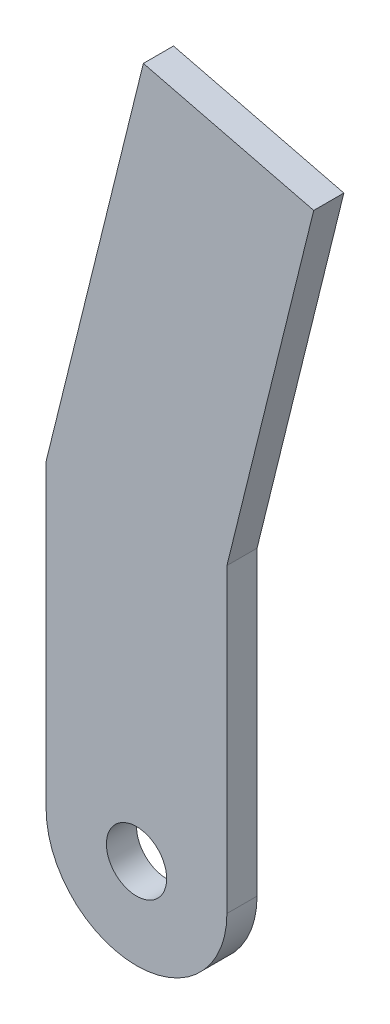
ISO-10303-21;
HEADER;
FILE_DESCRIPTION(('STEP AP214'),'2;1');
FILE_NAME('part.step','',(''),(''),'','','');
FILE_SCHEMA(('AUTOMOTIVE_DESIGN { 1 0 10303 214 1 1 1 1 }'));
ENDSEC;
DATA;
#1=APPLICATION_CONTEXT('core data for automotive mechanical design processes');
#2=APPLICATION_PROTOCOL_DEFINITION('international standard','automotive_design',2000,#1);
#3=PRODUCT_CONTEXT('',#1,'mechanical');
#4=PRODUCT('Part','Part','',(#3));
#5=PRODUCT_RELATED_PRODUCT_CATEGORY('part','',(#4));
#6=PRODUCT_DEFINITION_FORMATION('','',#4);
#7=PRODUCT_DEFINITION_CONTEXT('part definition',#1,'design');
#8=PRODUCT_DEFINITION('design','',#6,#7);
#9=PRODUCT_DEFINITION_SHAPE('','',#8);
#10=(LENGTH_UNIT() NAMED_UNIT(*) SI_UNIT(.MILLI.,.METRE.));
#11=(NAMED_UNIT(*) PLANE_ANGLE_UNIT() SI_UNIT($,.RADIAN.));
#12=(NAMED_UNIT(*) SI_UNIT($,.STERADIAN.) SOLID_ANGLE_UNIT());
#13=UNCERTAINTY_MEASURE_WITH_UNIT(LENGTH_MEASURE(1.E-05),#10,'distance_accuracy_value','');
#14=(GEOMETRIC_REPRESENTATION_CONTEXT(3) GLOBAL_UNCERTAINTY_ASSIGNED_CONTEXT((#13)) GLOBAL_UNIT_ASSIGNED_CONTEXT((#10,
#11,#12)) REPRESENTATION_CONTEXT('',''));
#15=CARTESIAN_POINT('',(0.,0.,0.));
#16=DIRECTION('',(0.,0.,1.));
#17=DIRECTION('',(1.,0.,0.));
#18=AXIS2_PLACEMENT_3D('',#15,#16,#17);
#19=CARTESIAN_POINT('',(0.,0.,5.));
#20=DIRECTION('',(0.,0.,1.));
#21=DIRECTION('',(1.,0.,0.));
#22=AXIS2_PLACEMENT_3D('',#19,#20,#21);
#23=PLANE('',#22);
#24=DIRECTION('',(0.,1.,0.));
#25=VECTOR('',#24,1.);
#26=CARTESIAN_POINT('',(-15.,0.,5.));
#27=LINE('',#26,#25);
#28=CARTESIAN_POINT('',(-15.,0.,5.));
#29=VERTEX_POINT('',#28);
#30=CARTESIAN_POINT('',(-15.,50.,5.));
#31=VERTEX_POINT('',#30);
#32=EDGE_CURVE('E179',#29,#31,#27,.T.);
#33=ORIENTED_EDGE('',*,*,#32,.F.);
#34=CARTESIAN_POINT('',(0.,0.,5.));
#35=DIRECTION('',(0.,0.,1.));
#36=DIRECTION('',(1.,0.,0.));
#37=AXIS2_PLACEMENT_3D('',#34,#35,#36);
#38=CIRCLE('',#37,15.);
#39=CARTESIAN_POINT('',(15.,0.,5.));
#40=VERTEX_POINT('',#39);
#41=EDGE_CURVE('E134',#29,#40,#38,.T.);
#42=ORIENTED_EDGE('',*,*,#41,.T.);
#43=DIRECTION('',(0.,1.,0.));
#44=VECTOR('',#43,1.);
#45=CARTESIAN_POINT('',(15.,0.,5.));
#46=LINE('',#45,#44);
#47=CARTESIAN_POINT('',(15.,50.,5.));
#48=VERTEX_POINT('',#47);
#49=EDGE_CURVE('E126',#40,#48,#46,.T.);
#50=ORIENTED_EDGE('',*,*,#49,.T.);
#51=DIRECTION('',(-0.240080703599402,-0.970752932397948,0.));
#52=VECTOR('',#51,1.);
#53=CARTESIAN_POINT('',(29.4048422159641,108.245175943877,5.));
#54=LINE('',#53,#52);
#55=CARTESIAN_POINT('',(29.4048422159641,108.245175943877,5.));
#56=VERTEX_POINT('',#55);
#57=EDGE_CURVE('E132',#56,#48,#54,.T.);
#58=ORIENTED_EDGE('',*,*,#57,.F.);
#59=DIRECTION('',(0.970752932397949,-0.240080703599402,0.));
#60=VECTOR('',#59,1.);
#61=CARTESIAN_POINT('',(1.13400454318761,115.236947354815,5.));
#62=LINE('',#61,#60);
#63=CARTESIAN_POINT('',(1.13400454318761,115.236947354815,5.));
#64=VERTEX_POINT('',#63);
#65=EDGE_CURVE('E151',#64,#56,#62,.T.);
#66=ORIENTED_EDGE('',*,*,#65,.F.);
#67=DIRECTION('',(0.240080703599402,0.970752932397949,0.));
#68=VECTOR('',#67,1.);
#69=CARTESIAN_POINT('',(-15.,50.,5.));
#70=LINE('',#69,#68);
#71=EDGE_CURVE('E154',#31,#64,#70,.T.);
#72=ORIENTED_EDGE('',*,*,#71,.F.);
#73=EDGE_LOOP('',(#33,#42,#50,#58,#66,#72));
#74=FACE_BOUND('',#73,.T.);
#75=CARTESIAN_POINT('',(0.,0.,5.));
#76=DIRECTION('',(0.,0.,1.));
#77=DIRECTION('',(1.,0.,0.));
#78=AXIS2_PLACEMENT_3D('',#75,#76,#77);
#79=CIRCLE('',#78,5.);
#80=CARTESIAN_POINT('',(5.,0.,5.));
#81=VERTEX_POINT('',#80);
#82=EDGE_CURVE('E165',#81,#81,#79,.T.);
#83=ORIENTED_EDGE('',*,*,#82,.F.);
#84=EDGE_LOOP('',(#83));
#85=FACE_BOUND('',#84,.T.);
#86=ADVANCED_FACE('F66',(#74,#85),#23,.T.);
#87=CARTESIAN_POINT('',(0.,0.,0.));
#88=DIRECTION('',(0.,0.,1.));
#89=DIRECTION('',(1.,0.,0.));
#90=AXIS2_PLACEMENT_3D('',#87,#88,#89);
#91=PLANE('',#90);
#92=DIRECTION('',(0.,1.,0.));
#93=VECTOR('',#92,1.);
#94=CARTESIAN_POINT('',(-15.,0.,0.));
#95=LINE('',#94,#93);
#96=CARTESIAN_POINT('',(-15.,0.,0.));
#97=VERTEX_POINT('',#96);
#98=CARTESIAN_POINT('',(-15.,50.,0.));
#99=VERTEX_POINT('',#98);
#100=EDGE_CURVE('E160',#97,#99,#95,.T.);
#101=ORIENTED_EDGE('',*,*,#100,.T.);
#102=DIRECTION('',(0.240080703599402,0.970752932397949,0.));
#103=VECTOR('',#102,1.);
#104=CARTESIAN_POINT('',(-15.,50.,0.));
#105=LINE('',#104,#103);
#106=CARTESIAN_POINT('',(1.13400454318761,115.236947354815,0.));
#107=VERTEX_POINT('',#106);
#108=EDGE_CURVE('E164',#99,#107,#105,.T.);
#109=ORIENTED_EDGE('',*,*,#108,.T.);
#110=DIRECTION('',(0.970752932397949,-0.240080703599402,0.));
#111=VECTOR('',#110,1.);
#112=CARTESIAN_POINT('',(1.13400454318761,115.236947354815,0.));
#113=LINE('',#112,#111);
#114=CARTESIAN_POINT('',(29.4048422159641,108.245175943877,0.));
#115=VERTEX_POINT('',#114);
#116=EDGE_CURVE('E169',#107,#115,#113,.T.);
#117=ORIENTED_EDGE('',*,*,#116,.T.);
#118=DIRECTION('',(-0.240080703599402,-0.970752932397948,0.));
#119=VECTOR('',#118,1.);
#120=CARTESIAN_POINT('',(29.4048422159641,108.245175943877,0.));
#121=LINE('',#120,#119);
#122=CARTESIAN_POINT('',(15.,50.,0.));
#123=VERTEX_POINT('',#122);
#124=EDGE_CURVE('E173',#115,#123,#121,.T.);
#125=ORIENTED_EDGE('',*,*,#124,.T.);
#126=DIRECTION('',(0.,1.,0.));
#127=VECTOR('',#126,1.);
#128=CARTESIAN_POINT('',(15.,0.,0.));
#129=LINE('',#128,#127);
#130=CARTESIAN_POINT('',(15.,0.,0.));
#131=VERTEX_POINT('',#130);
#132=EDGE_CURVE('E142',#131,#123,#129,.T.);
#133=ORIENTED_EDGE('',*,*,#132,.F.);
#134=CARTESIAN_POINT('',(0.,0.,0.));
#135=DIRECTION('',(0.,0.,1.));
#136=DIRECTION('',(1.,0.,0.));
#137=AXIS2_PLACEMENT_3D('',#134,#135,#136);
#138=CIRCLE('',#137,15.);
#139=EDGE_CURVE('E107',#97,#131,#138,.T.);
#140=ORIENTED_EDGE('',*,*,#139,.F.);
#141=EDGE_LOOP('',(#101,#109,#117,#125,#133,#140));
#142=FACE_BOUND('',#141,.T.);
#143=CARTESIAN_POINT('',(0.,0.,0.));
#144=DIRECTION('',(0.,0.,1.));
#145=DIRECTION('',(1.,0.,0.));
#146=AXIS2_PLACEMENT_3D('',#143,#144,#145);
#147=CIRCLE('',#146,5.);
#148=CARTESIAN_POINT('',(5.,0.,0.));
#149=VERTEX_POINT('',#148);
#150=EDGE_CURVE('E198',#149,#149,#147,.T.);
#151=ORIENTED_EDGE('',*,*,#150,.T.);
#152=EDGE_LOOP('',(#151));
#153=FACE_BOUND('',#152,.T.);
#154=ADVANCED_FACE('F190',(#142,#153),#91,.F.);
#155=CARTESIAN_POINT('',(-15.,0.,5.));
#156=DIRECTION('',(-1.,0.,0.));
#157=DIRECTION('',(0.,0.,1.));
#158=AXIS2_PLACEMENT_3D('',#155,#156,#157);
#159=PLANE('',#158);
#160=ORIENTED_EDGE('',*,*,#100,.F.);
#161=DIRECTION('',(0.,0.,-1.));
#162=VECTOR('',#161,1.);
#163=CARTESIAN_POINT('',(-15.,0.,5.));
#164=LINE('',#163,#162);
#165=EDGE_CURVE('E12',#29,#97,#164,.T.);
#166=ORIENTED_EDGE('',*,*,#165,.F.);
#167=ORIENTED_EDGE('',*,*,#32,.T.);
#168=DIRECTION('',(0.,0.,-1.));
#169=VECTOR('',#168,1.);
#170=CARTESIAN_POINT('',(-15.,50.,5.));
#171=LINE('',#170,#169);
#172=EDGE_CURVE('E70',#31,#99,#171,.T.);
#173=ORIENTED_EDGE('',*,*,#172,.T.);
#174=EDGE_LOOP('',(#160,#166,#167,#173));
#175=FACE_BOUND('',#174,.T.);
#176=ADVANCED_FACE('F68',(#175),#159,.T.);
#177=CARTESIAN_POINT('',(0.,0.,5.));
#178=DIRECTION('',(0.,0.,-1.));
#179=DIRECTION('',(-1.,0.,0.));
#180=AXIS2_PLACEMENT_3D('',#177,#178,#179);
#181=CYLINDRICAL_SURFACE('',#180,15.);
#182=ORIENTED_EDGE('',*,*,#139,.T.);
#183=DIRECTION('',(0.,0.,-1.));
#184=VECTOR('',#183,1.);
#185=CARTESIAN_POINT('',(15.,0.,5.));
#186=LINE('',#185,#184);
#187=EDGE_CURVE('E77',#40,#131,#186,.T.);
#188=ORIENTED_EDGE('',*,*,#187,.F.);
#189=ORIENTED_EDGE('',*,*,#41,.F.);
#190=ORIENTED_EDGE('',*,*,#165,.T.);
#191=EDGE_LOOP('',(#182,#188,#189,#190));
#192=FACE_BOUND('',#191,.T.);
#193=ADVANCED_FACE('F216',(#192),#181,.T.);
#194=CARTESIAN_POINT('',(15.,0.,5.));
#195=DIRECTION('',(-1.,0.,0.));
#196=DIRECTION('',(0.,0.,1.));
#197=AXIS2_PLACEMENT_3D('',#194,#195,#196);
#198=PLANE('',#197);
#199=ORIENTED_EDGE('',*,*,#132,.T.);
#200=DIRECTION('',(0.,0.,-1.));
#201=VECTOR('',#200,1.);
#202=CARTESIAN_POINT('',(15.,50.,5.));
#203=LINE('',#202,#201);
#204=EDGE_CURVE('E139',#48,#123,#203,.T.);
#205=ORIENTED_EDGE('',*,*,#204,.F.);
#206=ORIENTED_EDGE('',*,*,#49,.F.);
#207=ORIENTED_EDGE('',*,*,#187,.T.);
#208=EDGE_LOOP('',(#199,#205,#206,#207));
#209=FACE_BOUND('',#208,.T.);
#210=ADVANCED_FACE('F140',(#209),#198,.F.);
#211=CARTESIAN_POINT('',(29.4048422159641,108.245175943877,5.));
#212=DIRECTION('',(0.970752932397949,-0.240080703599402,0.));
#213=DIRECTION('',(0.240080703599402,0.970752932397949,0.));
#214=AXIS2_PLACEMENT_3D('',#211,#212,#213);
#215=PLANE('',#214);
#216=ORIENTED_EDGE('',*,*,#124,.F.);
#217=DIRECTION('',(0.,0.,-1.));
#218=VECTOR('',#217,1.);
#219=CARTESIAN_POINT('',(29.4048422159641,108.245175943877,5.));
#220=LINE('',#219,#218);
#221=EDGE_CURVE('E147',#56,#115,#220,.T.);
#222=ORIENTED_EDGE('',*,*,#221,.F.);
#223=ORIENTED_EDGE('',*,*,#57,.T.);
#224=ORIENTED_EDGE('',*,*,#204,.T.);
#225=EDGE_LOOP('',(#216,#222,#223,#224));
#226=FACE_BOUND('',#225,.T.);
#227=ADVANCED_FACE('F149',(#226),#215,.T.);
#228=CARTESIAN_POINT('',(1.13400454318761,115.236947354815,5.));
#229=DIRECTION('',(0.240080703599402,0.970752932397949,0.));
#230=DIRECTION('',(-0.970752932397949,0.240080703599402,0.));
#231=AXIS2_PLACEMENT_3D('',#228,#229,#230);
#232=PLANE('',#231);
#233=ORIENTED_EDGE('',*,*,#116,.F.);
#234=DIRECTION('',(0.,0.,-1.));
#235=VECTOR('',#234,1.);
#236=CARTESIAN_POINT('',(1.13400454318761,115.236947354815,5.));
#237=LINE('',#236,#235);
#238=EDGE_CURVE('E184',#64,#107,#237,.T.);
#239=ORIENTED_EDGE('',*,*,#238,.F.);
#240=ORIENTED_EDGE('',*,*,#65,.T.);
#241=ORIENTED_EDGE('',*,*,#221,.T.);
#242=EDGE_LOOP('',(#233,#239,#240,#241));
#243=FACE_BOUND('',#242,.T.);
#244=ADVANCED_FACE('F193',(#243),#232,.T.);
#245=CARTESIAN_POINT('',(-15.,50.,5.));
#246=DIRECTION('',(-0.970752932397949,0.240080703599402,0.));
#247=DIRECTION('',(-0.240080703599402,-0.970752932397949,0.));
#248=AXIS2_PLACEMENT_3D('',#245,#246,#247);
#249=PLANE('',#248);
#250=ORIENTED_EDGE('',*,*,#108,.F.);
#251=ORIENTED_EDGE('',*,*,#172,.F.);
#252=ORIENTED_EDGE('',*,*,#71,.T.);
#253=ORIENTED_EDGE('',*,*,#238,.T.);
#254=EDGE_LOOP('',(#250,#251,#252,#253));
#255=FACE_BOUND('',#254,.T.);
#256=ADVANCED_FACE('F188',(#255),#249,.T.);
#257=CARTESIAN_POINT('',(0.,0.,5.));
#258=DIRECTION('',(0.,0.,-1.));
#259=DIRECTION('',(-1.,0.,0.));
#260=AXIS2_PLACEMENT_3D('',#257,#258,#259);
#261=CYLINDRICAL_SURFACE('',#260,5.);
#262=ORIENTED_EDGE('',*,*,#82,.T.);
#263=EDGE_LOOP('',(#262));
#264=FACE_BOUND('',#263,.T.);
#265=ORIENTED_EDGE('',*,*,#150,.F.);
#266=EDGE_LOOP('',(#265));
#267=FACE_BOUND('',#266,.T.);
#268=ADVANCED_FACE('F206',(#264,#267),#261,.F.);
#269=CLOSED_SHELL('',(#86,#154,#176,#193,#210,#227,#244,#256,#268));
#270=MANIFOLD_SOLID_BREP('B2',#269);
#271=ADVANCED_BREP_SHAPE_REPRESENTATION('',(#18,#270),#14);
#272=SHAPE_DEFINITION_REPRESENTATION(#9,#271);
ENDSEC;
END-ISO-10303-21;
